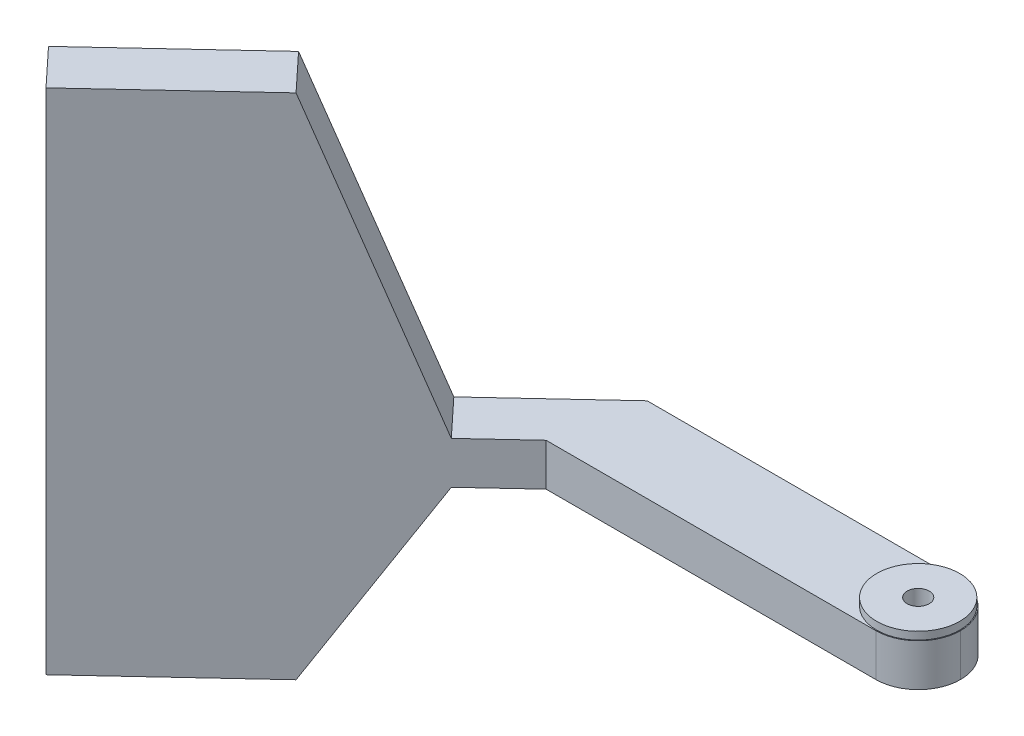
ISO-10303-21;
HEADER;
FILE_DESCRIPTION(('STEP AP214'),'2;1');
FILE_NAME('part.step','',(''),(''),'','','');
FILE_SCHEMA(('AUTOMOTIVE_DESIGN { 1 0 10303 214 1 1 1 1 }'));
ENDSEC;
DATA;
#1=APPLICATION_CONTEXT('core data for automotive mechanical design processes');
#2=APPLICATION_PROTOCOL_DEFINITION('international standard','automotive_design',2000,#1);
#3=PRODUCT_CONTEXT('',#1,'mechanical');
#4=PRODUCT('Part','Part','',(#3));
#5=PRODUCT_RELATED_PRODUCT_CATEGORY('part','',(#4));
#6=PRODUCT_DEFINITION_FORMATION('','',#4);
#7=PRODUCT_DEFINITION_CONTEXT('part definition',#1,'design');
#8=PRODUCT_DEFINITION('design','',#6,#7);
#9=PRODUCT_DEFINITION_SHAPE('','',#8);
#10=(LENGTH_UNIT() NAMED_UNIT(*) SI_UNIT(.MILLI.,.METRE.));
#11=(NAMED_UNIT(*) PLANE_ANGLE_UNIT() SI_UNIT($,.RADIAN.));
#12=(NAMED_UNIT(*) SI_UNIT($,.STERADIAN.) SOLID_ANGLE_UNIT());
#13=UNCERTAINTY_MEASURE_WITH_UNIT(LENGTH_MEASURE(1.E-05),#10,'distance_accuracy_value','');
#14=(GEOMETRIC_REPRESENTATION_CONTEXT(3) GLOBAL_UNCERTAINTY_ASSIGNED_CONTEXT((#13)) GLOBAL_UNIT_ASSIGNED_CONTEXT((#10,
#11,#12)) REPRESENTATION_CONTEXT('',''));
#15=CARTESIAN_POINT('',(0.,0.,0.));
#16=DIRECTION('',(0.,0.,1.));
#17=DIRECTION('',(1.,0.,0.));
#18=AXIS2_PLACEMENT_3D('',#15,#16,#17);
#19=CARTESIAN_POINT('',(0.,5.,0.));
#20=DIRECTION('',(0.,1.,0.));
#21=DIRECTION('',(0.,0.,1.));
#22=AXIS2_PLACEMENT_3D('',#19,#20,#21);
#23=PLANE('',#22);
#24=DIRECTION('',(-0.681998360062495,0.,-0.731353701619174));
#25=VECTOR('',#24,1.);
#26=CARTESIAN_POINT('',(-7.71670161603637,5.,5.39990543876824));
#27=LINE('',#26,#25);
#28=CARTESIAN_POINT('',(-7.71670161603637,5.,5.39990543876824));
#29=VERTEX_POINT('',#28);
#30=CARTESIAN_POINT('',(-11.8086917764113,5.,1.0117832290532));
#31=VERTEX_POINT('',#30);
#32=EDGE_CURVE('E135',#29,#31,#27,.T.);
#33=ORIENTED_EDGE('',*,*,#32,.F.);
#34=DIRECTION('',(0.731353701619174,0.,-0.681998360062495));
#35=VECTOR('',#34,1.);
#36=CARTESIAN_POINT('',(-0.895830090924158,5.,-0.960660159005643));
#37=LINE('',#36,#35);
#38=CARTESIAN_POINT('',(-1.92601198640916,5.,0.));
#39=VERTEX_POINT('',#38);
#40=EDGE_CURVE('E134',#29,#39,#37,.T.);
#41=ORIENTED_EDGE('',*,*,#40,.T.);
#42=DIRECTION('',(-1.,0.,0.));
#43=VECTOR('',#42,1.);
#44=CARTESIAN_POINT('',(0.,5.,0.));
#45=LINE('',#44,#43);
#46=CARTESIAN_POINT('',(37.,5.,0.));
#47=VERTEX_POINT('',#46);
#48=EDGE_CURVE('E146',#47,#39,#45,.T.);
#49=ORIENTED_EDGE('',*,*,#48,.F.);
#50=CARTESIAN_POINT('',(37.,5.,-5.00000000000001));
#51=DIRECTION('',(0.,1.,0.));
#52=DIRECTION('',(0.,0.,1.));
#53=AXIS2_PLACEMENT_3D('',#50,#51,#52);
#54=CIRCLE('',#53,5.);
#55=CARTESIAN_POINT('',(42.,5.,-5.));
#56=VERTEX_POINT('',#55);
#57=EDGE_CURVE('E44',#47,#56,#54,.T.);
#58=ORIENTED_EDGE('',*,*,#57,.T.);
#59=CARTESIAN_POINT('',(37.,5.,-5.));
#60=DIRECTION('',(0.,1.,0.));
#61=DIRECTION('',(0.,0.,1.));
#62=AXIS2_PLACEMENT_3D('',#59,#60,#61);
#63=CIRCLE('',#62,5.);
#64=CARTESIAN_POINT('',(37.,5.,-10.));
#65=VERTEX_POINT('',#64);
#66=EDGE_CURVE('E52',#56,#65,#63,.T.);
#67=ORIENTED_EDGE('',*,*,#66,.T.);
#68=DIRECTION('',(1.,0.,0.));
#69=VECTOR('',#68,1.);
#70=CARTESIAN_POINT('',(0.,5.,-10.));
#71=LINE('',#70,#69);
#72=CARTESIAN_POINT('',(0.,5.,-10.));
#73=VERTEX_POINT('',#72);
#74=EDGE_CURVE('E149',#73,#65,#71,.T.);
#75=ORIENTED_EDGE('',*,*,#74,.F.);
#76=DIRECTION('',(-0.731353701619174,0.,0.681998360062495));
#77=VECTOR('',#76,1.);
#78=CARTESIAN_POINT('',(-4.98782025129912,5.,-5.34878236872068));
#79=LINE('',#78,#77);
#80=EDGE_CURVE('E152',#73,#31,#79,.T.);
#81=ORIENTED_EDGE('',*,*,#80,.T.);
#82=EDGE_LOOP('',(#33,#41,#49,#58,#67,#75,#81));
#83=FACE_BOUND('',#82,.T.);
#84=CARTESIAN_POINT('',(37.,5.,-4.99999999999999));
#85=DIRECTION('',(0.,1.,0.));
#86=DIRECTION('',(0.,0.,1.));
#87=AXIS2_PLACEMENT_3D('',#84,#85,#86);
#88=CIRCLE('',#87,4.9);
#89=CARTESIAN_POINT('',(37.,5.,-0.0999999999999873));
#90=VERTEX_POINT('',#89);
#91=EDGE_CURVE('E203',#90,#90,#88,.T.);
#92=ORIENTED_EDGE('',*,*,#91,.F.);
#93=EDGE_LOOP('',(#92));
#94=FACE_BOUND('',#93,.T.);
#95=ADVANCED_FACE('F35',(#83,#94),#23,.T.);
#96=CARTESIAN_POINT('',(0.,0.,0.));
#97=DIRECTION('',(0.,1.,0.));
#98=DIRECTION('',(0.,0.,1.));
#99=AXIS2_PLACEMENT_3D('',#96,#97,#98);
#100=PLANE('',#99);
#101=CARTESIAN_POINT('',(37.,0.,-4.99999999999999));
#102=DIRECTION('',(0.,1.,0.));
#103=DIRECTION('',(0.,0.,1.));
#104=AXIS2_PLACEMENT_3D('',#101,#102,#103);
#105=CIRCLE('',#104,1.29999999999999);
#106=CARTESIAN_POINT('',(37.,0.,-3.69999999999999));
#107=VERTEX_POINT('',#106);
#108=EDGE_CURVE('E39',#107,#107,#105,.T.);
#109=ORIENTED_EDGE('',*,*,#108,.T.);
#110=EDGE_LOOP('',(#109));
#111=FACE_BOUND('',#110,.T.);
#112=DIRECTION('',(0.731353701619174,0.,-0.681998360062495));
#113=VECTOR('',#112,1.);
#114=CARTESIAN_POINT('',(-0.895830090924158,0.,-0.960660159005643));
#115=LINE('',#114,#113);
#116=CARTESIAN_POINT('',(-7.71670161603637,0.,5.39990543876824));
#117=VERTEX_POINT('',#116);
#118=CARTESIAN_POINT('',(-1.92601198640916,0.,0.));
#119=VERTEX_POINT('',#118);
#120=EDGE_CURVE('E150',#117,#119,#115,.T.);
#121=ORIENTED_EDGE('',*,*,#120,.F.);
#122=DIRECTION('',(-0.681998360062495,0.,-0.731353701619174));
#123=VECTOR('',#122,1.);
#124=CARTESIAN_POINT('',(-7.71670161603637,0.,5.39990543876824));
#125=LINE('',#124,#123);
#126=CARTESIAN_POINT('',(-11.8086917764113,0.,1.0117832290532));
#127=VERTEX_POINT('',#126);
#128=EDGE_CURVE('E216',#117,#127,#125,.T.);
#129=ORIENTED_EDGE('',*,*,#128,.T.);
#130=DIRECTION('',(-0.731353701619174,0.,0.681998360062495));
#131=VECTOR('',#130,1.);
#132=CARTESIAN_POINT('',(-4.98782025129912,0.,-5.34878236872068));
#133=LINE('',#132,#131);
#134=CARTESIAN_POINT('',(0.,0.,-10.));
#135=VERTEX_POINT('',#134);
#136=EDGE_CURVE('E164',#135,#127,#133,.T.);
#137=ORIENTED_EDGE('',*,*,#136,.F.);
#138=DIRECTION('',(1.,0.,0.));
#139=VECTOR('',#138,1.);
#140=CARTESIAN_POINT('',(0.,0.,-10.));
#141=LINE('',#140,#139);
#142=CARTESIAN_POINT('',(37.,0.,-10.));
#143=VERTEX_POINT('',#142);
#144=EDGE_CURVE('E160',#135,#143,#141,.T.);
#145=ORIENTED_EDGE('',*,*,#144,.T.);
#146=CARTESIAN_POINT('',(37.,0.,-5.));
#147=DIRECTION('',(0.,1.,0.));
#148=DIRECTION('',(0.,0.,1.));
#149=AXIS2_PLACEMENT_3D('',#146,#147,#148);
#150=CIRCLE('',#149,5.);
#151=CARTESIAN_POINT('',(42.,0.,-5.));
#152=VERTEX_POINT('',#151);
#153=EDGE_CURVE('E176',#143,#152,#150,.F.);
#154=ORIENTED_EDGE('',*,*,#153,.T.);
#155=CARTESIAN_POINT('',(37.,0.,-5.00000000000001));
#156=DIRECTION('',(0.,1.,0.));
#157=DIRECTION('',(0.,0.,1.));
#158=AXIS2_PLACEMENT_3D('',#155,#156,#157);
#159=CIRCLE('',#158,5.);
#160=CARTESIAN_POINT('',(37.,0.,0.));
#161=VERTEX_POINT('',#160);
#162=EDGE_CURVE('E178',#152,#161,#159,.F.);
#163=ORIENTED_EDGE('',*,*,#162,.T.);
#164=DIRECTION('',(-1.,0.,0.));
#165=VECTOR('',#164,1.);
#166=CARTESIAN_POINT('',(0.,0.,0.));
#167=LINE('',#166,#165);
#168=EDGE_CURVE('E157',#161,#119,#167,.T.);
#169=ORIENTED_EDGE('',*,*,#168,.T.);
#170=EDGE_LOOP('',(#121,#129,#137,#145,#154,#163,#169));
#171=FACE_BOUND('',#170,.T.);
#172=ADVANCED_FACE('F191',(#111,#171),#100,.F.);
#173=CARTESIAN_POINT('',(0.,5.,0.));
#174=DIRECTION('',(0.,0.,1.));
#175=DIRECTION('',(1.,0.,0.));
#176=AXIS2_PLACEMENT_3D('',#173,#174,#175);
#177=PLANE('',#176);
#178=ORIENTED_EDGE('',*,*,#168,.F.);
#179=DIRECTION('',(0.,-1.,0.));
#180=VECTOR('',#179,1.);
#181=CARTESIAN_POINT('',(37.,5.,0.));
#182=LINE('',#181,#180);
#183=EDGE_CURVE('E180',#161,#47,#182,.F.);
#184=ORIENTED_EDGE('',*,*,#183,.T.);
#185=ORIENTED_EDGE('',*,*,#48,.T.);
#186=DIRECTION('',(0.,-1.,0.));
#187=VECTOR('',#186,1.);
#188=CARTESIAN_POINT('',(-1.92601198640916,5.,0.));
#189=LINE('',#188,#187);
#190=EDGE_CURVE('E156',#39,#119,#189,.T.);
#191=ORIENTED_EDGE('',*,*,#190,.T.);
#192=EDGE_LOOP('',(#178,#184,#185,#191));
#193=FACE_BOUND('',#192,.T.);
#194=ADVANCED_FACE('F256',(#193),#177,.T.);
#195=CARTESIAN_POINT('',(0.,5.,-10.));
#196=DIRECTION('',(0.,0.,-1.));
#197=DIRECTION('',(-1.,0.,0.));
#198=AXIS2_PLACEMENT_3D('',#195,#196,#197);
#199=PLANE('',#198);
#200=ORIENTED_EDGE('',*,*,#74,.T.);
#201=DIRECTION('',(0.,-1.,0.));
#202=VECTOR('',#201,1.);
#203=CARTESIAN_POINT('',(37.,0.,-10.));
#204=LINE('',#203,#202);
#205=EDGE_CURVE('E11',#65,#143,#204,.T.);
#206=ORIENTED_EDGE('',*,*,#205,.T.);
#207=ORIENTED_EDGE('',*,*,#144,.F.);
#208=DIRECTION('',(0.,-1.,0.));
#209=VECTOR('',#208,1.);
#210=CARTESIAN_POINT('',(0.,5.,-10.));
#211=LINE('',#210,#209);
#212=EDGE_CURVE('E174',#73,#135,#211,.T.);
#213=ORIENTED_EDGE('',*,*,#212,.F.);
#214=EDGE_LOOP('',(#200,#206,#207,#213));
#215=FACE_BOUND('',#214,.T.);
#216=ADVANCED_FACE('F250',(#215),#199,.T.);
#217=CARTESIAN_POINT('',(-4.98782025129912,5.,-5.34878236872068));
#218=DIRECTION('',(0.681998360062495,0.,0.731353701619174));
#219=DIRECTION('',(0.731353701619174,0.,-0.681998360062495));
#220=AXIS2_PLACEMENT_3D('',#217,#218,#219);
#221=PLANE('',#220);
#222=ORIENTED_EDGE('',*,*,#136,.T.);
#223=DIRECTION('',(-0.39788750787913,-0.839057650485038,0.371036103683003));
#224=VECTOR('',#223,1.);
#225=CARTESIAN_POINT('',(-11.8086917764113,0.,1.0117832290532));
#226=LINE('',#225,#224);
#227=CARTESIAN_POINT('',(-21.2928436138714,-20.,9.85589789670485));
#228=VERTEX_POINT('',#227);
#229=EDGE_CURVE('E213',#127,#228,#226,.T.);
#230=ORIENTED_EDGE('',*,*,#229,.T.);
#231=DIRECTION('',(0.731353701619174,0.,-0.681998360062495));
#232=VECTOR('',#231,1.);
#233=CARTESIAN_POINT('',(-21.2928436138714,-20.,9.85589789670485));
#234=LINE('',#233,#232);
#235=CARTESIAN_POINT('',(-36.5676850809587,-20.,24.0999180031247));
#236=VERTEX_POINT('',#235);
#237=EDGE_CURVE('E221',#236,#228,#234,.T.);
#238=ORIENTED_EDGE('',*,*,#237,.F.);
#239=DIRECTION('',(0.,-1.,0.));
#240=VECTOR('',#239,1.);
#241=CARTESIAN_POINT('',(-36.5676850809587,5.,24.0999180031247));
#242=LINE('',#241,#240);
#243=CARTESIAN_POINT('',(-36.5676850809587,40.,24.0999180031247));
#244=VERTEX_POINT('',#243);
#245=EDGE_CURVE('E172',#244,#236,#242,.T.);
#246=ORIENTED_EDGE('',*,*,#245,.F.);
#247=DIRECTION('',(-0.731353701619174,0.,0.681998360062495));
#248=VECTOR('',#247,1.);
#249=CARTESIAN_POINT('',(-21.2928436138714,40.,9.85589789670484));
#250=LINE('',#249,#248);
#251=CARTESIAN_POINT('',(-21.2928436138714,40.,9.85589789670484));
#252=VERTEX_POINT('',#251);
#253=EDGE_CURVE('E142',#252,#244,#250,.T.);
#254=ORIENTED_EDGE('',*,*,#253,.F.);
#255=DIRECTION('',(0.254095416370213,-0.937705313598097,-0.236947809083652));
#256=VECTOR('',#255,1.);
#257=CARTESIAN_POINT('',(-11.8086917764113,5.,1.0117832290532));
#258=LINE('',#257,#256);
#259=EDGE_CURVE('E122',#252,#31,#258,.T.);
#260=ORIENTED_EDGE('',*,*,#259,.T.);
#261=ORIENTED_EDGE('',*,*,#80,.F.);
#262=ORIENTED_EDGE('',*,*,#212,.T.);
#263=EDGE_LOOP('',(#222,#230,#238,#246,#254,#260,#261,#262));
#264=FACE_BOUND('',#263,.T.);
#265=ADVANCED_FACE('F233',(#264),#221,.F.);
#266=CARTESIAN_POINT('',(-31.5798648296596,5.,29.4487003718454));
#267=DIRECTION('',(0.731353701619174,0.,-0.681998360062495));
#268=DIRECTION('',(-0.681998360062495,0.,-0.731353701619174));
#269=AXIS2_PLACEMENT_3D('',#266,#267,#268);
#270=PLANE('',#269);
#271=ORIENTED_EDGE('',*,*,#245,.T.);
#272=DIRECTION('',(-0.681998360062495,0.,-0.731353701619174));
#273=VECTOR('',#272,1.);
#274=CARTESIAN_POINT('',(-36.5676850809587,-20.,24.0999180031247));
#275=LINE('',#274,#273);
#276=CARTESIAN_POINT('',(-32.4756949205837,-20.,28.4880402128398));
#277=VERTEX_POINT('',#276);
#278=EDGE_CURVE('E230',#277,#236,#275,.T.);
#279=ORIENTED_EDGE('',*,*,#278,.F.);
#280=DIRECTION('',(0.,-1.,0.));
#281=VECTOR('',#280,1.);
#282=CARTESIAN_POINT('',(-32.4756949205837,5.,28.4880402128398));
#283=LINE('',#282,#281);
#284=CARTESIAN_POINT('',(-32.4756949205837,40.,28.4880402128398));
#285=VERTEX_POINT('',#284);
#286=EDGE_CURVE('E170',#285,#277,#283,.T.);
#287=ORIENTED_EDGE('',*,*,#286,.F.);
#288=DIRECTION('',(0.681998360062495,0.,0.731353701619174));
#289=VECTOR('',#288,1.);
#290=CARTESIAN_POINT('',(-36.5676850809587,40.,24.0999180031247));
#291=LINE('',#290,#289);
#292=EDGE_CURVE('E140',#244,#285,#291,.T.);
#293=ORIENTED_EDGE('',*,*,#292,.F.);
#294=EDGE_LOOP('',(#271,#279,#287,#293));
#295=FACE_BOUND('',#294,.T.);
#296=ADVANCED_FACE('F238',(#295),#270,.F.);
#297=CARTESIAN_POINT('',(-0.895830090924158,5.,-0.960660159005643));
#298=DIRECTION('',(-0.681998360062495,0.,-0.731353701619174));
#299=DIRECTION('',(-0.731353701619174,0.,0.681998360062495));
#300=AXIS2_PLACEMENT_3D('',#297,#298,#299);
#301=PLANE('',#300);
#302=ORIENTED_EDGE('',*,*,#40,.F.);
#303=DIRECTION('',(0.254095416370213,-0.937705313598097,-0.236947809083652));
#304=VECTOR('',#303,1.);
#305=CARTESIAN_POINT('',(-7.71670161603637,5.,5.39990543876824));
#306=LINE('',#305,#304);
#307=CARTESIAN_POINT('',(-17.2008534534964,40.,14.2440201064199));
#308=VERTEX_POINT('',#307);
#309=EDGE_CURVE('E119',#308,#29,#306,.T.);
#310=ORIENTED_EDGE('',*,*,#309,.F.);
#311=DIRECTION('',(0.731353701619174,0.,-0.681998360062494));
#312=VECTOR('',#311,1.);
#313=CARTESIAN_POINT('',(-32.4756949205837,40.,28.4880402128398));
#314=LINE('',#313,#312);
#315=EDGE_CURVE('E127',#285,#308,#314,.T.);
#316=ORIENTED_EDGE('',*,*,#315,.F.);
#317=ORIENTED_EDGE('',*,*,#286,.T.);
#318=DIRECTION('',(-0.731353701619174,0.,0.681998360062495));
#319=VECTOR('',#318,1.);
#320=CARTESIAN_POINT('',(-32.4756949205837,-20.,28.4880402128398));
#321=LINE('',#320,#319);
#322=CARTESIAN_POINT('',(-17.2008534534965,-20.,14.2440201064199));
#323=VERTEX_POINT('',#322);
#324=EDGE_CURVE('E227',#323,#277,#321,.T.);
#325=ORIENTED_EDGE('',*,*,#324,.F.);
#326=DIRECTION('',(-0.39788750787913,-0.839057650485038,0.371036103683003));
#327=VECTOR('',#326,1.);
#328=CARTESIAN_POINT('',(-7.71670161603637,0.,5.39990543876824));
#329=LINE('',#328,#327);
#330=EDGE_CURVE('E214',#117,#323,#329,.T.);
#331=ORIENTED_EDGE('',*,*,#330,.F.);
#332=ORIENTED_EDGE('',*,*,#120,.T.);
#333=ORIENTED_EDGE('',*,*,#190,.F.);
#334=EDGE_LOOP('',(#302,#310,#316,#317,#325,#331,#332,#333));
#335=FACE_BOUND('',#334,.T.);
#336=ADVANCED_FACE('F132',(#335),#301,.F.);
#337=CARTESIAN_POINT('',(37.,5.,-5.));
#338=DIRECTION('',(0.,1.,0.));
#339=DIRECTION('',(0.,0.,1.));
#340=AXIS2_PLACEMENT_3D('',#337,#338,#339);
#341=CYLINDRICAL_SURFACE('',#340,5.);
#342=ORIENTED_EDGE('',*,*,#205,.F.);
#343=ORIENTED_EDGE('',*,*,#66,.F.);
#344=DIRECTION('',(0.,-1.,0.));
#345=VECTOR('',#344,1.);
#346=CARTESIAN_POINT('',(42.,5.,-5.));
#347=LINE('',#346,#345);
#348=EDGE_CURVE('E161',#152,#56,#347,.F.);
#349=ORIENTED_EDGE('',*,*,#348,.F.);
#350=ORIENTED_EDGE('',*,*,#153,.F.);
#351=EDGE_LOOP('',(#342,#343,#349,#350));
#352=FACE_BOUND('',#351,.T.);
#353=ADVANCED_FACE('F37',(#352),#341,.T.);
#354=CARTESIAN_POINT('',(37.,5.,-5.00000000000001));
#355=DIRECTION('',(0.,1.,0.));
#356=DIRECTION('',(0.,0.,1.));
#357=AXIS2_PLACEMENT_3D('',#354,#355,#356);
#358=CYLINDRICAL_SURFACE('',#357,5.);
#359=ORIENTED_EDGE('',*,*,#57,.F.);
#360=ORIENTED_EDGE('',*,*,#183,.F.);
#361=ORIENTED_EDGE('',*,*,#162,.F.);
#362=ORIENTED_EDGE('',*,*,#348,.T.);
#363=EDGE_LOOP('',(#359,#360,#361,#362));
#364=FACE_BOUND('',#363,.T.);
#365=ADVANCED_FACE('F197',(#364),#358,.T.);
#366=CARTESIAN_POINT('',(37.,-5.,-4.99999999999999));
#367=DIRECTION('',(0.,1.,0.));
#368=DIRECTION('',(0.,0.,1.));
#369=AXIS2_PLACEMENT_3D('',#366,#367,#368);
#370=CYLINDRICAL_SURFACE('',#369,1.29999999999999);
#371=ORIENTED_EDGE('',*,*,#108,.F.);
#372=EDGE_LOOP('',(#371));
#373=FACE_BOUND('',#372,.T.);
#374=CARTESIAN_POINT('',(37.,5.9,-4.99999999999999));
#375=DIRECTION('',(0.,1.,0.));
#376=DIRECTION('',(0.,0.,1.));
#377=AXIS2_PLACEMENT_3D('',#374,#375,#376);
#378=CIRCLE('',#377,1.29999999999999);
#379=CARTESIAN_POINT('',(37.,5.9,-3.7));
#380=VERTEX_POINT('',#379);
#381=EDGE_CURVE('E201',#380,#380,#378,.T.);
#382=ORIENTED_EDGE('',*,*,#381,.T.);
#383=EDGE_LOOP('',(#382));
#384=FACE_BOUND('',#383,.T.);
#385=ADVANCED_FACE('F194',(#373,#384),#370,.F.);
#386=CARTESIAN_POINT('',(0.,40.,0.));
#387=DIRECTION('',(0.,1.,0.));
#388=DIRECTION('',(0.,0.,1.));
#389=AXIS2_PLACEMENT_3D('',#386,#387,#388);
#390=PLANE('',#389);
#391=ORIENTED_EDGE('',*,*,#253,.T.);
#392=ORIENTED_EDGE('',*,*,#292,.T.);
#393=ORIENTED_EDGE('',*,*,#315,.T.);
#394=DIRECTION('',(-0.681998360062494,0.,-0.731353701619174));
#395=VECTOR('',#394,1.);
#396=CARTESIAN_POINT('',(-17.2008534534964,40.,14.2440201064199));
#397=LINE('',#396,#395);
#398=EDGE_CURVE('E116',#308,#252,#397,.T.);
#399=ORIENTED_EDGE('',*,*,#398,.T.);
#400=EDGE_LOOP('',(#391,#392,#393,#399));
#401=FACE_BOUND('',#400,.T.);
#402=ADVANCED_FACE('F138',(#401),#390,.T.);
#403=CARTESIAN_POINT('',(0.,-20.,0.));
#404=DIRECTION('',(0.,1.,0.));
#405=DIRECTION('',(0.,0.,1.));
#406=AXIS2_PLACEMENT_3D('',#403,#404,#405);
#407=PLANE('',#406);
#408=ORIENTED_EDGE('',*,*,#237,.T.);
#409=DIRECTION('',(0.681998360062494,0.,0.731353701619174));
#410=VECTOR('',#409,1.);
#411=CARTESIAN_POINT('',(-17.2008534534965,-20.,14.2440201064199));
#412=LINE('',#411,#410);
#413=EDGE_CURVE('E224',#228,#323,#412,.T.);
#414=ORIENTED_EDGE('',*,*,#413,.T.);
#415=ORIENTED_EDGE('',*,*,#324,.T.);
#416=ORIENTED_EDGE('',*,*,#278,.T.);
#417=EDGE_LOOP('',(#408,#414,#415,#416));
#418=FACE_BOUND('',#417,.T.);
#419=ADVANCED_FACE('F242',(#418),#407,.F.);
#420=CARTESIAN_POINT('',(-7.71670161603637,0.,5.39990543876824));
#421=DIRECTION('',(0.613647918554119,-0.544042515951215,-0.572235941628685));
#422=DIRECTION('',(-0.681998360062495,0.,-0.731353701619174));
#423=AXIS2_PLACEMENT_3D('',#420,#421,#422);
#424=PLANE('',#423);
#425=ORIENTED_EDGE('',*,*,#229,.F.);
#426=ORIENTED_EDGE('',*,*,#128,.F.);
#427=ORIENTED_EDGE('',*,*,#330,.T.);
#428=ORIENTED_EDGE('',*,*,#413,.F.);
#429=EDGE_LOOP('',(#425,#426,#427,#428));
#430=FACE_BOUND('',#429,.T.);
#431=ADVANCED_FACE('F244',(#430),#424,.T.);
#432=CARTESIAN_POINT('',(-7.71670161603637,5.,5.39990543876824));
#433=DIRECTION('',(0.685794252127937,0.347431640542272,-0.63951348609579));
#434=DIRECTION('',(-0.681998360062495,0.,-0.731353701619174));
#435=AXIS2_PLACEMENT_3D('',#432,#433,#434);
#436=PLANE('',#435);
#437=ORIENTED_EDGE('',*,*,#259,.F.);
#438=ORIENTED_EDGE('',*,*,#398,.F.);
#439=ORIENTED_EDGE('',*,*,#309,.T.);
#440=ORIENTED_EDGE('',*,*,#32,.T.);
#441=EDGE_LOOP('',(#437,#438,#439,#440));
#442=FACE_BOUND('',#441,.T.);
#443=ADVANCED_FACE('F118',(#442),#436,.T.);
#444=CARTESIAN_POINT('',(37.,5.9,-4.99999999999999));
#445=DIRECTION('',(0.,1.,0.));
#446=DIRECTION('',(0.,0.,1.));
#447=AXIS2_PLACEMENT_3D('',#444,#445,#446);
#448=PLANE('',#447);
#449=CARTESIAN_POINT('',(37.,5.9,-4.99999999999999));
#450=DIRECTION('',(0.,1.,0.));
#451=DIRECTION('',(0.,0.,1.));
#452=AXIS2_PLACEMENT_3D('',#449,#450,#451);
#453=CIRCLE('',#452,4.9);
#454=CARTESIAN_POINT('',(37.,5.9,-0.0999999999999873));
#455=VERTEX_POINT('',#454);
#456=EDGE_CURVE('E206',#455,#455,#453,.T.);
#457=ORIENTED_EDGE('',*,*,#456,.T.);
#458=EDGE_LOOP('',(#457));
#459=FACE_BOUND('',#458,.T.);
#460=ORIENTED_EDGE('',*,*,#381,.F.);
#461=EDGE_LOOP('',(#460));
#462=FACE_BOUND('',#461,.T.);
#463=ADVANCED_FACE('F386',(#459,#462),#448,.T.);
#464=CARTESIAN_POINT('',(37.,5.9,-4.99999999999999));
#465=DIRECTION('',(0.,-1.,0.));
#466=DIRECTION('',(0.,0.,-1.));
#467=AXIS2_PLACEMENT_3D('',#464,#465,#466);
#468=CYLINDRICAL_SURFACE('',#467,4.9);
#469=ORIENTED_EDGE('',*,*,#456,.F.);
#470=EDGE_LOOP('',(#469));
#471=FACE_BOUND('',#470,.T.);
#472=ORIENTED_EDGE('',*,*,#91,.T.);
#473=EDGE_LOOP('',(#472));
#474=FACE_BOUND('',#473,.T.);
#475=ADVANCED_FACE('F402',(#471,#474),#468,.T.);
#476=CLOSED_SHELL('',(#95,#172,#194,#216,#265,#296,#336,#353,#365,#385,#402,#419,#431,#443,#463,#475));
#477=MANIFOLD_SOLID_BREP('B2',#476);
#478=ADVANCED_BREP_SHAPE_REPRESENTATION('',(#18,#477),#14);
#479=SHAPE_DEFINITION_REPRESENTATION(#9,#478);
ENDSEC;
END-ISO-10303-21;
